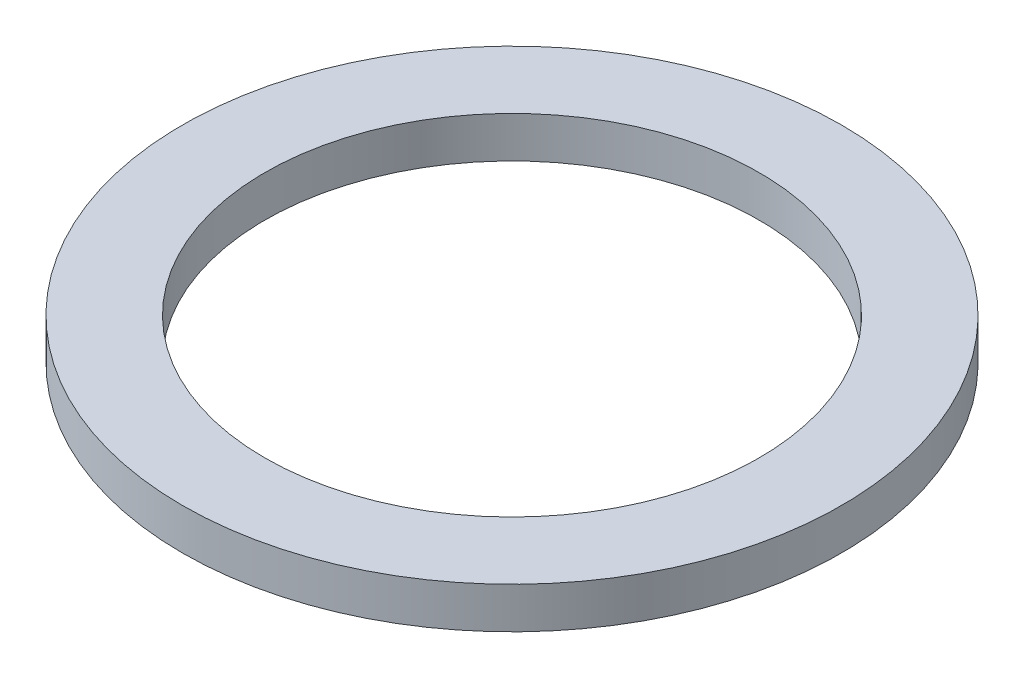
ISO-10303-21;
HEADER;
FILE_DESCRIPTION(('STEP AP214'),'2;1');
FILE_NAME('part.step','',(''),(''),'','','');
FILE_SCHEMA(('AUTOMOTIVE_DESIGN { 1 0 10303 214 1 1 1 1 }'));
ENDSEC;
DATA;
#1=APPLICATION_CONTEXT('core data for automotive mechanical design processes');
#2=APPLICATION_PROTOCOL_DEFINITION('international standard','automotive_design',2000,#1);
#3=PRODUCT_CONTEXT('',#1,'mechanical');
#4=PRODUCT('Part','Part','',(#3));
#5=PRODUCT_RELATED_PRODUCT_CATEGORY('part','',(#4));
#6=PRODUCT_DEFINITION_FORMATION('','',#4);
#7=PRODUCT_DEFINITION_CONTEXT('part definition',#1,'design');
#8=PRODUCT_DEFINITION('design','',#6,#7);
#9=PRODUCT_DEFINITION_SHAPE('','',#8);
#10=(LENGTH_UNIT() NAMED_UNIT(*) SI_UNIT(.MILLI.,.METRE.));
#11=(NAMED_UNIT(*) PLANE_ANGLE_UNIT() SI_UNIT($,.RADIAN.));
#12=(NAMED_UNIT(*) SI_UNIT($,.STERADIAN.) SOLID_ANGLE_UNIT());
#13=UNCERTAINTY_MEASURE_WITH_UNIT(LENGTH_MEASURE(1.E-05),#10,'distance_accuracy_value','');
#14=(GEOMETRIC_REPRESENTATION_CONTEXT(3) GLOBAL_UNCERTAINTY_ASSIGNED_CONTEXT((#13)) GLOBAL_UNIT_ASSIGNED_CONTEXT((#10,
#11,#12)) REPRESENTATION_CONTEXT('',''));
#15=CARTESIAN_POINT('',(0.,0.,0.));
#16=DIRECTION('',(0.,0.,1.));
#17=DIRECTION('',(1.,0.,0.));
#18=AXIS2_PLACEMENT_3D('',#15,#16,#17);
#19=CARTESIAN_POINT('',(0.,3.175,0.));
#20=DIRECTION('',(0.,1.,0.));
#21=DIRECTION('',(0.,0.,1.));
#22=AXIS2_PLACEMENT_3D('',#19,#20,#21);
#23=PLANE('',#22);
#24=CARTESIAN_POINT('',(0.,3.175,0.));
#25=DIRECTION('',(0.,1.,0.));
#26=DIRECTION('',(0.,0.,1.));
#27=AXIS2_PLACEMENT_3D('',#24,#25,#26);
#28=CIRCLE('',#27,50.8);
#29=CARTESIAN_POINT('',(0.,3.175,50.8));
#30=VERTEX_POINT('',#29);
#31=EDGE_CURVE('E10',#30,#30,#28,.T.);
#32=ORIENTED_EDGE('',*,*,#31,.T.);
#33=EDGE_LOOP('',(#32));
#34=FACE_BOUND('',#33,.T.);
#35=CARTESIAN_POINT('',(0.,3.175,0.));
#36=DIRECTION('',(0.,1.,0.));
#37=DIRECTION('',(0.,0.,1.));
#38=AXIS2_PLACEMENT_3D('',#35,#36,#37);
#39=CIRCLE('',#38,38.1);
#40=CARTESIAN_POINT('',(0.,3.175,38.1));
#41=VERTEX_POINT('',#40);
#42=EDGE_CURVE('E49',#41,#41,#39,.T.);
#43=ORIENTED_EDGE('',*,*,#42,.F.);
#44=EDGE_LOOP('',(#43));
#45=FACE_BOUND('',#44,.T.);
#46=ADVANCED_FACE('F35',(#34,#45),#23,.T.);
#47=CARTESIAN_POINT('',(0.,-3.175,0.));
#48=DIRECTION('',(0.,1.,0.));
#49=DIRECTION('',(0.,0.,1.));
#50=AXIS2_PLACEMENT_3D('',#47,#48,#49);
#51=PLANE('',#50);
#52=CARTESIAN_POINT('',(0.,-3.175,0.));
#53=DIRECTION('',(0.,1.,0.));
#54=DIRECTION('',(0.,0.,1.));
#55=AXIS2_PLACEMENT_3D('',#52,#53,#54);
#56=CIRCLE('',#55,50.8);
#57=CARTESIAN_POINT('',(0.,-3.175,50.8));
#58=VERTEX_POINT('',#57);
#59=EDGE_CURVE('E39',#58,#58,#56,.T.);
#60=ORIENTED_EDGE('',*,*,#59,.F.);
#61=EDGE_LOOP('',(#60));
#62=FACE_BOUND('',#61,.T.);
#63=CARTESIAN_POINT('',(0.,-3.175,0.));
#64=DIRECTION('',(0.,1.,0.));
#65=DIRECTION('',(0.,0.,1.));
#66=AXIS2_PLACEMENT_3D('',#63,#64,#65);
#67=CIRCLE('',#66,38.1);
#68=CARTESIAN_POINT('',(0.,-3.175,38.1));
#69=VERTEX_POINT('',#68);
#70=EDGE_CURVE('E51',#69,#69,#67,.T.);
#71=ORIENTED_EDGE('',*,*,#70,.T.);
#72=EDGE_LOOP('',(#71));
#73=FACE_BOUND('',#72,.T.);
#74=ADVANCED_FACE('F64',(#62,#73),#51,.F.);
#75=CARTESIAN_POINT('',(0.,3.175,0.));
#76=DIRECTION('',(0.,-1.,0.));
#77=DIRECTION('',(0.,0.,-1.));
#78=AXIS2_PLACEMENT_3D('',#75,#76,#77);
#79=CYLINDRICAL_SURFACE('',#78,50.8);
#80=ORIENTED_EDGE('',*,*,#31,.F.);
#81=EDGE_LOOP('',(#80));
#82=FACE_BOUND('',#81,.T.);
#83=ORIENTED_EDGE('',*,*,#59,.T.);
#84=EDGE_LOOP('',(#83));
#85=FACE_BOUND('',#84,.T.);
#86=ADVANCED_FACE('F37',(#82,#85),#79,.T.);
#87=CARTESIAN_POINT('',(0.,3.175,0.));
#88=DIRECTION('',(0.,-1.,0.));
#89=DIRECTION('',(0.,0.,-1.));
#90=AXIS2_PLACEMENT_3D('',#87,#88,#89);
#91=CYLINDRICAL_SURFACE('',#90,38.1);
#92=ORIENTED_EDGE('',*,*,#42,.T.);
#93=EDGE_LOOP('',(#92));
#94=FACE_BOUND('',#93,.T.);
#95=ORIENTED_EDGE('',*,*,#70,.F.);
#96=EDGE_LOOP('',(#95));
#97=FACE_BOUND('',#96,.T.);
#98=ADVANCED_FACE('F60',(#94,#97),#91,.F.);
#99=CLOSED_SHELL('',(#46,#74,#86,#98));
#100=MANIFOLD_SOLID_BREP('B2',#99);
#101=ADVANCED_BREP_SHAPE_REPRESENTATION('',(#18,#100),#14);
#102=SHAPE_DEFINITION_REPRESENTATION(#9,#101);
ENDSEC;
END-ISO-10303-21;
